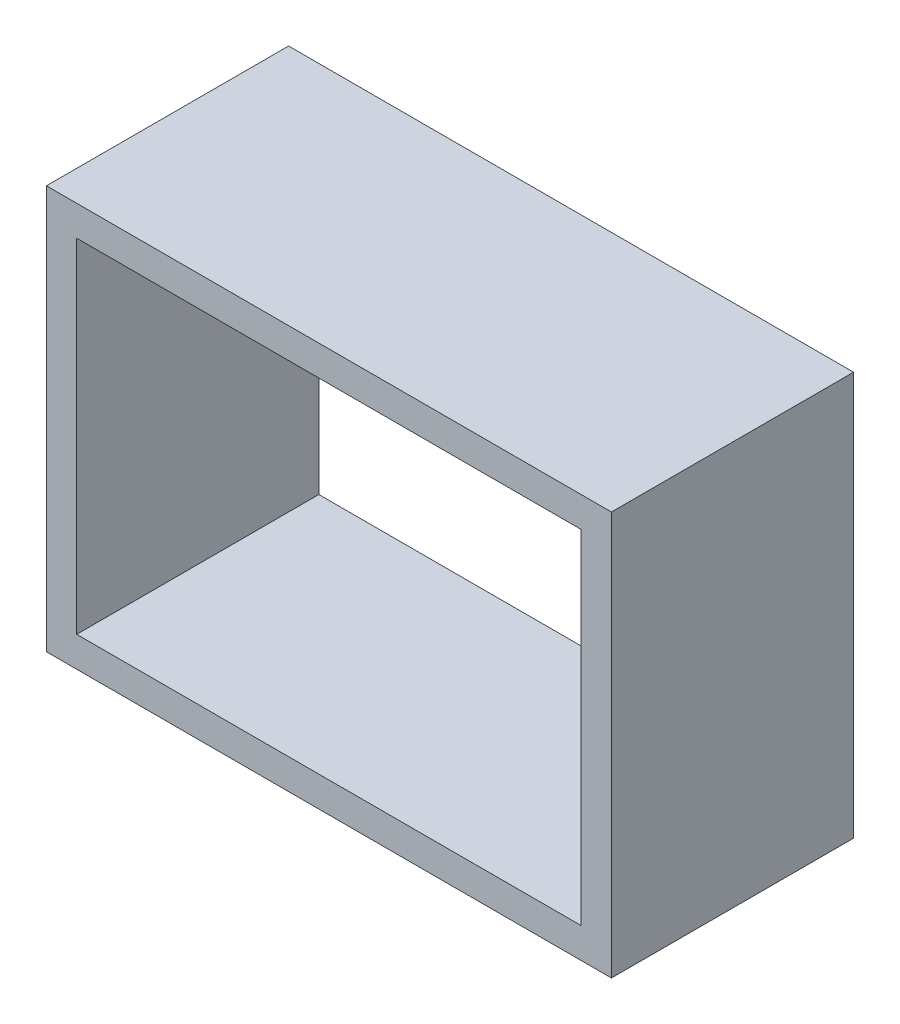
ISO-10303-21;
HEADER;
FILE_DESCRIPTION(('STEP AP214'),'2;1');
FILE_NAME('part.step','',(''),(''),'','','');
FILE_SCHEMA(('AUTOMOTIVE_DESIGN { 1 0 10303 214 1 1 1 1 }'));
ENDSEC;
DATA;
#1=APPLICATION_CONTEXT('core data for automotive mechanical design processes');
#2=APPLICATION_PROTOCOL_DEFINITION('international standard','automotive_design',2000,#1);
#3=PRODUCT_CONTEXT('',#1,'mechanical');
#4=PRODUCT('Part','Part','',(#3));
#5=PRODUCT_RELATED_PRODUCT_CATEGORY('part','',(#4));
#6=PRODUCT_DEFINITION_FORMATION('','',#4);
#7=PRODUCT_DEFINITION_CONTEXT('part definition',#1,'design');
#8=PRODUCT_DEFINITION('design','',#6,#7);
#9=PRODUCT_DEFINITION_SHAPE('','',#8);
#10=(LENGTH_UNIT() NAMED_UNIT(*) SI_UNIT(.MILLI.,.METRE.));
#11=(NAMED_UNIT(*) PLANE_ANGLE_UNIT() SI_UNIT($,.RADIAN.));
#12=(NAMED_UNIT(*) SI_UNIT($,.STERADIAN.) SOLID_ANGLE_UNIT());
#13=UNCERTAINTY_MEASURE_WITH_UNIT(LENGTH_MEASURE(1.E-05),#10,'distance_accuracy_value','');
#14=(GEOMETRIC_REPRESENTATION_CONTEXT(3) GLOBAL_UNCERTAINTY_ASSIGNED_CONTEXT((#13)) GLOBAL_UNIT_ASSIGNED_CONTEXT((#10,
#11,#12)) REPRESENTATION_CONTEXT('',''));
#15=CARTESIAN_POINT('',(0.,0.,0.));
#16=DIRECTION('',(0.,0.,1.));
#17=DIRECTION('',(1.,0.,0.));
#18=AXIS2_PLACEMENT_3D('',#15,#16,#17);
#19=CARTESIAN_POINT('',(0.,0.,120.));
#20=DIRECTION('',(1.,0.,0.));
#21=DIRECTION('',(0.,1.,0.));
#22=AXIS2_PLACEMENT_3D('',#19,#20,#21);
#23=PLANE('',#22);
#24=DIRECTION('',(0.,-1.,0.));
#25=VECTOR('',#24,1.);
#26=CARTESIAN_POINT('',(0.,0.,0.));
#27=LINE('',#26,#25);
#28=CARTESIAN_POINT('',(0.,0.,0.));
#29=VERTEX_POINT('',#28);
#30=CARTESIAN_POINT('',(0.,-200.,0.));
#31=VERTEX_POINT('',#30);
#32=EDGE_CURVE('E147',#29,#31,#27,.T.);
#33=ORIENTED_EDGE('',*,*,#32,.T.);
#34=DIRECTION('',(0.,0.,-1.));
#35=VECTOR('',#34,1.);
#36=CARTESIAN_POINT('',(0.,-200.,120.));
#37=LINE('',#36,#35);
#38=CARTESIAN_POINT('',(0.,-200.,120.));
#39=VERTEX_POINT('',#38);
#40=EDGE_CURVE('E11',#39,#31,#37,.T.);
#41=ORIENTED_EDGE('',*,*,#40,.F.);
#42=DIRECTION('',(0.,-1.,0.));
#43=VECTOR('',#42,1.);
#44=CARTESIAN_POINT('',(0.,0.,120.));
#45=LINE('',#44,#43);
#46=CARTESIAN_POINT('',(0.,0.,120.));
#47=VERTEX_POINT('',#46);
#48=EDGE_CURVE('E153',#47,#39,#45,.T.);
#49=ORIENTED_EDGE('',*,*,#48,.F.);
#50=DIRECTION('',(0.,0.,-1.));
#51=VECTOR('',#50,1.);
#52=CARTESIAN_POINT('',(0.,0.,120.));
#53=LINE('',#52,#51);
#54=EDGE_CURVE('E167',#47,#29,#53,.T.);
#55=ORIENTED_EDGE('',*,*,#54,.T.);
#56=EDGE_LOOP('',(#33,#41,#49,#55));
#57=FACE_BOUND('',#56,.T.);
#58=ADVANCED_FACE('F39',(#57),#23,.F.);
#59=CARTESIAN_POINT('',(0.,-200.,120.));
#60=DIRECTION('',(0.,1.,0.));
#61=DIRECTION('',(0.,0.,1.));
#62=AXIS2_PLACEMENT_3D('',#59,#60,#61);
#63=PLANE('',#62);
#64=DIRECTION('',(1.,0.,0.));
#65=VECTOR('',#64,1.);
#66=CARTESIAN_POINT('',(0.,-200.,0.));
#67=LINE('',#66,#65);
#68=CARTESIAN_POINT('',(280.,-200.,0.));
#69=VERTEX_POINT('',#68);
#70=EDGE_CURVE('E171',#31,#69,#67,.T.);
#71=ORIENTED_EDGE('',*,*,#70,.T.);
#72=DIRECTION('',(0.,0.,-1.));
#73=VECTOR('',#72,1.);
#74=CARTESIAN_POINT('',(280.,-200.,120.));
#75=LINE('',#74,#73);
#76=CARTESIAN_POINT('',(280.,-200.,120.));
#77=VERTEX_POINT('',#76);
#78=EDGE_CURVE('E47',#77,#69,#75,.T.);
#79=ORIENTED_EDGE('',*,*,#78,.F.);
#80=DIRECTION('',(1.,0.,0.));
#81=VECTOR('',#80,1.);
#82=CARTESIAN_POINT('',(0.,-200.,120.));
#83=LINE('',#82,#81);
#84=EDGE_CURVE('E157',#39,#77,#83,.T.);
#85=ORIENTED_EDGE('',*,*,#84,.F.);
#86=ORIENTED_EDGE('',*,*,#40,.T.);
#87=EDGE_LOOP('',(#71,#79,#85,#86));
#88=FACE_BOUND('',#87,.T.);
#89=ADVANCED_FACE('F205',(#88),#63,.F.);
#90=CARTESIAN_POINT('',(280.,0.,120.));
#91=DIRECTION('',(-1.,0.,0.));
#92=DIRECTION('',(0.,0.,1.));
#93=AXIS2_PLACEMENT_3D('',#90,#91,#92);
#94=PLANE('',#93);
#95=DIRECTION('',(0.,1.,0.));
#96=VECTOR('',#95,1.);
#97=CARTESIAN_POINT('',(280.,0.,0.));
#98=LINE('',#97,#96);
#99=CARTESIAN_POINT('',(280.,0.,0.));
#100=VERTEX_POINT('',#99);
#101=EDGE_CURVE('E174',#69,#100,#98,.T.);
#102=ORIENTED_EDGE('',*,*,#101,.T.);
#103=DIRECTION('',(0.,0.,-1.));
#104=VECTOR('',#103,1.);
#105=CARTESIAN_POINT('',(280.,0.,120.));
#106=LINE('',#105,#104);
#107=CARTESIAN_POINT('',(280.,0.,120.));
#108=VERTEX_POINT('',#107);
#109=EDGE_CURVE('E182',#108,#100,#106,.T.);
#110=ORIENTED_EDGE('',*,*,#109,.F.);
#111=DIRECTION('',(0.,1.,0.));
#112=VECTOR('',#111,1.);
#113=CARTESIAN_POINT('',(280.,0.,120.));
#114=LINE('',#113,#112);
#115=EDGE_CURVE('E161',#77,#108,#114,.T.);
#116=ORIENTED_EDGE('',*,*,#115,.F.);
#117=ORIENTED_EDGE('',*,*,#78,.T.);
#118=EDGE_LOOP('',(#102,#110,#116,#117));
#119=FACE_BOUND('',#118,.T.);
#120=ADVANCED_FACE('F191',(#119),#94,.F.);
#121=CARTESIAN_POINT('',(0.,0.,120.));
#122=DIRECTION('',(0.,-1.,0.));
#123=DIRECTION('',(0.,0.,-1.));
#124=AXIS2_PLACEMENT_3D('',#121,#122,#123);
#125=PLANE('',#124);
#126=DIRECTION('',(-1.,0.,0.));
#127=VECTOR('',#126,1.);
#128=CARTESIAN_POINT('',(0.,0.,0.));
#129=LINE('',#128,#127);
#130=EDGE_CURVE('E158',#100,#29,#129,.T.);
#131=ORIENTED_EDGE('',*,*,#130,.T.);
#132=ORIENTED_EDGE('',*,*,#54,.F.);
#133=DIRECTION('',(-1.,0.,0.));
#134=VECTOR('',#133,1.);
#135=CARTESIAN_POINT('',(0.,0.,120.));
#136=LINE('',#135,#134);
#137=EDGE_CURVE('E164',#108,#47,#136,.T.);
#138=ORIENTED_EDGE('',*,*,#137,.F.);
#139=ORIENTED_EDGE('',*,*,#109,.T.);
#140=EDGE_LOOP('',(#131,#132,#138,#139));
#141=FACE_BOUND('',#140,.T.);
#142=ADVANCED_FACE('F200',(#141),#125,.F.);
#143=CARTESIAN_POINT('',(0.,0.,120.));
#144=DIRECTION('',(0.,0.,1.));
#145=DIRECTION('',(1.,0.,0.));
#146=AXIS2_PLACEMENT_3D('',#143,#144,#145);
#147=PLANE('',#146);
#148=DIRECTION('',(0.,-1.,0.));
#149=VECTOR('',#148,1.);
#150=CARTESIAN_POINT('',(265.,-15.,120.));
#151=LINE('',#150,#149);
#152=CARTESIAN_POINT('',(265.,-15.,120.));
#153=VERTEX_POINT('',#152);
#154=CARTESIAN_POINT('',(265.,-185.,120.));
#155=VERTEX_POINT('',#154);
#156=EDGE_CURVE('E106',#153,#155,#151,.T.);
#157=ORIENTED_EDGE('',*,*,#156,.T.);
#158=DIRECTION('',(-1.,0.,0.));
#159=VECTOR('',#158,1.);
#160=CARTESIAN_POINT('',(265.,-185.,120.));
#161=LINE('',#160,#159);
#162=CARTESIAN_POINT('',(15.,-185.,120.));
#163=VERTEX_POINT('',#162);
#164=EDGE_CURVE('E116',#155,#163,#161,.T.);
#165=ORIENTED_EDGE('',*,*,#164,.T.);
#166=DIRECTION('',(0.,1.,0.));
#167=VECTOR('',#166,1.);
#168=CARTESIAN_POINT('',(15.,-15.,120.));
#169=LINE('',#168,#167);
#170=CARTESIAN_POINT('',(15.,-15.,120.));
#171=VERTEX_POINT('',#170);
#172=EDGE_CURVE('E54',#163,#171,#169,.T.);
#173=ORIENTED_EDGE('',*,*,#172,.T.);
#174=DIRECTION('',(1.,0.,0.));
#175=VECTOR('',#174,1.);
#176=CARTESIAN_POINT('',(265.,-15.,120.));
#177=LINE('',#176,#175);
#178=EDGE_CURVE('E113',#171,#153,#177,.T.);
#179=ORIENTED_EDGE('',*,*,#178,.T.);
#180=EDGE_LOOP('',(#157,#165,#173,#179));
#181=FACE_BOUND('',#180,.T.);
#182=ORIENTED_EDGE('',*,*,#48,.T.);
#183=ORIENTED_EDGE('',*,*,#84,.T.);
#184=ORIENTED_EDGE('',*,*,#115,.T.);
#185=ORIENTED_EDGE('',*,*,#137,.T.);
#186=EDGE_LOOP('',(#182,#183,#184,#185));
#187=FACE_BOUND('',#186,.T.);
#188=ADVANCED_FACE('F121',(#181,#187),#147,.T.);
#189=CARTESIAN_POINT('',(0.,0.,0.));
#190=DIRECTION('',(0.,0.,1.));
#191=DIRECTION('',(1.,0.,0.));
#192=AXIS2_PLACEMENT_3D('',#189,#190,#191);
#193=PLANE('',#192);
#194=DIRECTION('',(-1.,0.,0.));
#195=VECTOR('',#194,1.);
#196=CARTESIAN_POINT('',(265.,-185.,0.));
#197=LINE('',#196,#195);
#198=CARTESIAN_POINT('',(265.,-185.,0.));
#199=VERTEX_POINT('',#198);
#200=CARTESIAN_POINT('',(15.,-185.,0.));
#201=VERTEX_POINT('',#200);
#202=EDGE_CURVE('E138',#199,#201,#197,.T.);
#203=ORIENTED_EDGE('',*,*,#202,.F.);
#204=DIRECTION('',(0.,-1.,0.));
#205=VECTOR('',#204,1.);
#206=CARTESIAN_POINT('',(265.,-15.,0.));
#207=LINE('',#206,#205);
#208=CARTESIAN_POINT('',(265.,-15.,0.));
#209=VERTEX_POINT('',#208);
#210=EDGE_CURVE('E62',#209,#199,#207,.T.);
#211=ORIENTED_EDGE('',*,*,#210,.F.);
#212=DIRECTION('',(1.,0.,0.));
#213=VECTOR('',#212,1.);
#214=CARTESIAN_POINT('',(265.,-15.,0.));
#215=LINE('',#214,#213);
#216=CARTESIAN_POINT('',(15.,-15.,0.));
#217=VERTEX_POINT('',#216);
#218=EDGE_CURVE('E125',#217,#209,#215,.T.);
#219=ORIENTED_EDGE('',*,*,#218,.F.);
#220=DIRECTION('',(0.,1.,0.));
#221=VECTOR('',#220,1.);
#222=CARTESIAN_POINT('',(15.,-15.,0.));
#223=LINE('',#222,#221);
#224=EDGE_CURVE('E129',#201,#217,#223,.T.);
#225=ORIENTED_EDGE('',*,*,#224,.F.);
#226=EDGE_LOOP('',(#203,#211,#219,#225));
#227=FACE_BOUND('',#226,.T.);
#228=ORIENTED_EDGE('',*,*,#32,.F.);
#229=ORIENTED_EDGE('',*,*,#130,.F.);
#230=ORIENTED_EDGE('',*,*,#101,.F.);
#231=ORIENTED_EDGE('',*,*,#70,.F.);
#232=EDGE_LOOP('',(#228,#229,#230,#231));
#233=FACE_BOUND('',#232,.T.);
#234=ADVANCED_FACE('F197',(#227,#233),#193,.F.);
#235=CARTESIAN_POINT('',(265.,-15.,120.));
#236=DIRECTION('',(1.,0.,0.));
#237=DIRECTION('',(0.,0.,-1.));
#238=AXIS2_PLACEMENT_3D('',#235,#236,#237);
#239=PLANE('',#238);
#240=ORIENTED_EDGE('',*,*,#210,.T.);
#241=DIRECTION('',(0.,0.,-1.));
#242=VECTOR('',#241,1.);
#243=CARTESIAN_POINT('',(265.,-185.,120.));
#244=LINE('',#243,#242);
#245=EDGE_CURVE('E102',#155,#199,#244,.T.);
#246=ORIENTED_EDGE('',*,*,#245,.F.);
#247=ORIENTED_EDGE('',*,*,#156,.F.);
#248=DIRECTION('',(0.,0.,-1.));
#249=VECTOR('',#248,1.);
#250=CARTESIAN_POINT('',(265.,-15.,120.));
#251=LINE('',#250,#249);
#252=EDGE_CURVE('E144',#153,#209,#251,.T.);
#253=ORIENTED_EDGE('',*,*,#252,.T.);
#254=EDGE_LOOP('',(#240,#246,#247,#253));
#255=FACE_BOUND('',#254,.T.);
#256=ADVANCED_FACE('F104',(#255),#239,.F.);
#257=CARTESIAN_POINT('',(265.,-15.,120.));
#258=DIRECTION('',(0.,1.,0.));
#259=DIRECTION('',(0.,0.,1.));
#260=AXIS2_PLACEMENT_3D('',#257,#258,#259);
#261=PLANE('',#260);
#262=ORIENTED_EDGE('',*,*,#218,.T.);
#263=ORIENTED_EDGE('',*,*,#252,.F.);
#264=ORIENTED_EDGE('',*,*,#178,.F.);
#265=DIRECTION('',(0.,0.,-1.));
#266=VECTOR('',#265,1.);
#267=CARTESIAN_POINT('',(15.,-15.,120.));
#268=LINE('',#267,#266);
#269=EDGE_CURVE('E148',#171,#217,#268,.T.);
#270=ORIENTED_EDGE('',*,*,#269,.T.);
#271=EDGE_LOOP('',(#262,#263,#264,#270));
#272=FACE_BOUND('',#271,.T.);
#273=ADVANCED_FACE('F222',(#272),#261,.F.);
#274=CARTESIAN_POINT('',(15.,-15.,120.));
#275=DIRECTION('',(-1.,0.,0.));
#276=DIRECTION('',(0.,-1.,0.));
#277=AXIS2_PLACEMENT_3D('',#274,#275,#276);
#278=PLANE('',#277);
#279=ORIENTED_EDGE('',*,*,#224,.T.);
#280=ORIENTED_EDGE('',*,*,#269,.F.);
#281=ORIENTED_EDGE('',*,*,#172,.F.);
#282=DIRECTION('',(0.,0.,-1.));
#283=VECTOR('',#282,1.);
#284=CARTESIAN_POINT('',(15.,-185.,120.));
#285=LINE('',#284,#283);
#286=EDGE_CURVE('E112',#163,#201,#285,.T.);
#287=ORIENTED_EDGE('',*,*,#286,.T.);
#288=EDGE_LOOP('',(#279,#280,#281,#287));
#289=FACE_BOUND('',#288,.T.);
#290=ADVANCED_FACE('F225',(#289),#278,.F.);
#291=CARTESIAN_POINT('',(265.,-185.,120.));
#292=DIRECTION('',(0.,-1.,0.));
#293=DIRECTION('',(0.,0.,-1.));
#294=AXIS2_PLACEMENT_3D('',#291,#292,#293);
#295=PLANE('',#294);
#296=ORIENTED_EDGE('',*,*,#202,.T.);
#297=ORIENTED_EDGE('',*,*,#286,.F.);
#298=ORIENTED_EDGE('',*,*,#164,.F.);
#299=ORIENTED_EDGE('',*,*,#245,.T.);
#300=EDGE_LOOP('',(#296,#297,#298,#299));
#301=FACE_BOUND('',#300,.T.);
#302=ADVANCED_FACE('F117',(#301),#295,.F.);
#303=CLOSED_SHELL('',(#58,#89,#120,#142,#188,#234,#256,#273,#290,#302));
#304=MANIFOLD_SOLID_BREP('B2',#303);
#305=ADVANCED_BREP_SHAPE_REPRESENTATION('',(#18,#304),#14);
#306=SHAPE_DEFINITION_REPRESENTATION(#9,#305);
ENDSEC;
END-ISO-10303-21;
